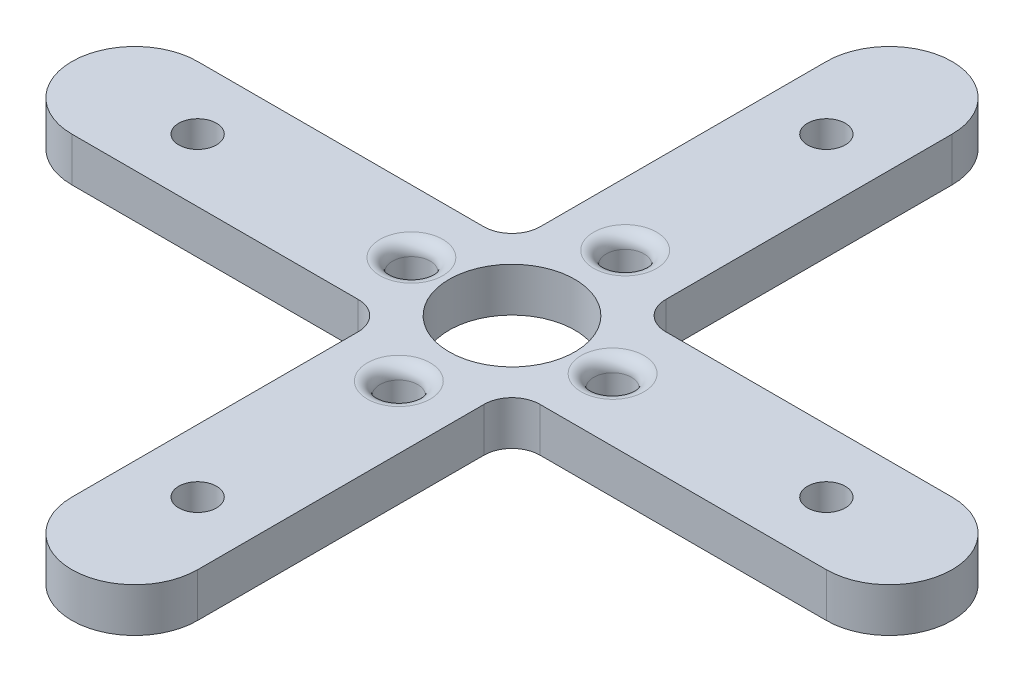
ISO-10303-21;
HEADER;
FILE_DESCRIPTION(('STEP AP214'),'2;1');
FILE_NAME('part.step','',(''),(''),'','','');
FILE_SCHEMA(('AUTOMOTIVE_DESIGN { 1 0 10303 214 1 1 1 1 }'));
ENDSEC;
DATA;
#1=APPLICATION_CONTEXT('core data for automotive mechanical design processes');
#2=APPLICATION_PROTOCOL_DEFINITION('international standard','automotive_design',2000,#1);
#3=PRODUCT_CONTEXT('',#1,'mechanical');
#4=PRODUCT('Part','Part','',(#3));
#5=PRODUCT_RELATED_PRODUCT_CATEGORY('part','',(#4));
#6=PRODUCT_DEFINITION_FORMATION('','',#4);
#7=PRODUCT_DEFINITION_CONTEXT('part definition',#1,'design');
#8=PRODUCT_DEFINITION('design','',#6,#7);
#9=PRODUCT_DEFINITION_SHAPE('','',#8);
#10=(LENGTH_UNIT() NAMED_UNIT(*) SI_UNIT(.MILLI.,.METRE.));
#11=(NAMED_UNIT(*) PLANE_ANGLE_UNIT() SI_UNIT($,.RADIAN.));
#12=(NAMED_UNIT(*) SI_UNIT($,.STERADIAN.) SOLID_ANGLE_UNIT());
#13=UNCERTAINTY_MEASURE_WITH_UNIT(LENGTH_MEASURE(1.E-05),#10,'distance_accuracy_value','');
#14=(GEOMETRIC_REPRESENTATION_CONTEXT(3) GLOBAL_UNCERTAINTY_ASSIGNED_CONTEXT((#13)) GLOBAL_UNIT_ASSIGNED_CONTEXT((#10,
#11,#12)) REPRESENTATION_CONTEXT('',''));
#15=CARTESIAN_POINT('',(0.,0.,0.));
#16=DIRECTION('',(0.,0.,1.));
#17=DIRECTION('',(1.,0.,0.));
#18=AXIS2_PLACEMENT_3D('',#15,#16,#17);
#19=CARTESIAN_POINT('',(-1.52427468028531,2.5,3.54645563387217));
#20=DIRECTION('',(0.,1.,0.));
#21=DIRECTION('',(0.,0.,1.));
#22=AXIS2_PLACEMENT_3D('',#19,#20,#21);
#23=TOROIDAL_SURFACE('',#22,2.5,1.);
#24=CARTESIAN_POINT('',(-1.52427468028531,2.5,3.54645563387217));
#25=DIRECTION('',(0.,1.,0.));
#26=DIRECTION('',(0.,0.,1.));
#27=AXIS2_PLACEMENT_3D('',#24,#25,#26);
#28=CIRCLE('',#27,1.5);
#29=CARTESIAN_POINT('',(-1.52427468028531,2.5,5.04645563387217));
#30=VERTEX_POINT('',#29);
#31=EDGE_CURVE('E50',#30,#30,#28,.T.);
#32=ORIENTED_EDGE('',*,*,#31,.F.);
#33=EDGE_LOOP('',(#32));
#34=FACE_BOUND('',#33,.T.);
#35=CARTESIAN_POINT('',(-1.52427468028531,3.5,3.54645563387217));
#36=DIRECTION('',(0.,1.,0.));
#37=DIRECTION('',(0.,0.,1.));
#38=AXIS2_PLACEMENT_3D('',#35,#36,#37);
#39=CIRCLE('',#38,2.5);
#40=CARTESIAN_POINT('',(-1.52427468028531,3.5,6.04645563387217));
#41=VERTEX_POINT('',#40);
#42=EDGE_CURVE('E11',#41,#41,#39,.F.);
#43=ORIENTED_EDGE('',*,*,#42,.F.);
#44=EDGE_LOOP('',(#43));
#45=FACE_BOUND('',#44,.T.);
#46=ADVANCED_FACE('F41',(#34,#45),#23,.T.);
#47=CARTESIAN_POINT('',(6.47572531971469,2.5,12.5464556338721));
#48=DIRECTION('',(0.,1.,0.));
#49=DIRECTION('',(0.,0.,1.));
#50=AXIS2_PLACEMENT_3D('',#47,#48,#49);
#51=TOROIDAL_SURFACE('',#50,2.5,1.);
#52=CARTESIAN_POINT('',(6.47572531971469,2.5,12.5464556338721));
#53=DIRECTION('',(0.,1.,0.));
#54=DIRECTION('',(0.,0.,1.));
#55=AXIS2_PLACEMENT_3D('',#52,#53,#54);
#56=CIRCLE('',#55,1.5);
#57=CARTESIAN_POINT('',(6.47572531971469,2.5,14.0464556338721));
#58=VERTEX_POINT('',#57);
#59=EDGE_CURVE('E344',#58,#58,#56,.T.);
#60=ORIENTED_EDGE('',*,*,#59,.F.);
#61=EDGE_LOOP('',(#60));
#62=FACE_BOUND('',#61,.T.);
#63=CARTESIAN_POINT('',(6.47572531971469,3.5,12.5464556338721));
#64=DIRECTION('',(0.,1.,0.));
#65=DIRECTION('',(0.,0.,1.));
#66=AXIS2_PLACEMENT_3D('',#63,#64,#65);
#67=CIRCLE('',#66,2.5);
#68=CARTESIAN_POINT('',(6.47572531971469,3.5,15.0464556338721));
#69=VERTEX_POINT('',#68);
#70=EDGE_CURVE('E348',#69,#69,#67,.F.);
#71=ORIENTED_EDGE('',*,*,#70,.F.);
#72=EDGE_LOOP('',(#71));
#73=FACE_BOUND('',#72,.T.);
#74=ADVANCED_FACE('F360',(#62,#73),#51,.T.);
#75=CARTESIAN_POINT('',(14.4757253197147,2.5,3.54645563387217));
#76=DIRECTION('',(0.,1.,0.));
#77=DIRECTION('',(0.,0.,1.));
#78=AXIS2_PLACEMENT_3D('',#75,#76,#77);
#79=TOROIDAL_SURFACE('',#78,2.5,1.);
#80=CARTESIAN_POINT('',(14.4757253197147,2.5,3.54645563387217));
#81=DIRECTION('',(0.,1.,0.));
#82=DIRECTION('',(0.,0.,1.));
#83=AXIS2_PLACEMENT_3D('',#80,#81,#82);
#84=CIRCLE('',#83,1.5);
#85=CARTESIAN_POINT('',(14.4757253197147,2.5,5.04645563387217));
#86=VERTEX_POINT('',#85);
#87=EDGE_CURVE('E336',#86,#86,#84,.T.);
#88=ORIENTED_EDGE('',*,*,#87,.F.);
#89=EDGE_LOOP('',(#88));
#90=FACE_BOUND('',#89,.T.);
#91=CARTESIAN_POINT('',(14.4757253197147,3.5,3.54645563387217));
#92=DIRECTION('',(0.,1.,0.));
#93=DIRECTION('',(0.,0.,1.));
#94=AXIS2_PLACEMENT_3D('',#91,#92,#93);
#95=CIRCLE('',#94,2.5);
#96=CARTESIAN_POINT('',(14.4757253197147,3.5,6.04645563387217));
#97=VERTEX_POINT('',#96);
#98=EDGE_CURVE('E340',#97,#97,#95,.F.);
#99=ORIENTED_EDGE('',*,*,#98,.F.);
#100=EDGE_LOOP('',(#99));
#101=FACE_BOUND('',#100,.T.);
#102=ADVANCED_FACE('F544',(#90,#101),#79,.T.);
#103=CARTESIAN_POINT('',(6.47572531971469,2.5,-5.45354436612787));
#104=DIRECTION('',(0.,1.,0.));
#105=DIRECTION('',(0.,0.,1.));
#106=AXIS2_PLACEMENT_3D('',#103,#104,#105);
#107=TOROIDAL_SURFACE('',#106,2.5,1.);
#108=CARTESIAN_POINT('',(6.47572531971469,2.5,-5.45354436612787));
#109=DIRECTION('',(0.,1.,0.));
#110=DIRECTION('',(0.,0.,1.));
#111=AXIS2_PLACEMENT_3D('',#108,#109,#110);
#112=CIRCLE('',#111,1.5);
#113=CARTESIAN_POINT('',(6.47572531971469,2.5,-3.95354436612787));
#114=VERTEX_POINT('',#113);
#115=EDGE_CURVE('E328',#114,#114,#112,.T.);
#116=ORIENTED_EDGE('',*,*,#115,.F.);
#117=EDGE_LOOP('',(#116));
#118=FACE_BOUND('',#117,.T.);
#119=CARTESIAN_POINT('',(6.47572531971469,3.5,-5.45354436612787));
#120=DIRECTION('',(0.,1.,0.));
#121=DIRECTION('',(0.,0.,1.));
#122=AXIS2_PLACEMENT_3D('',#119,#120,#121);
#123=CIRCLE('',#122,2.5);
#124=CARTESIAN_POINT('',(6.47572531971469,3.5,-2.95354436612787));
#125=VERTEX_POINT('',#124);
#126=EDGE_CURVE('E332',#125,#125,#123,.F.);
#127=ORIENTED_EDGE('',*,*,#126,.F.);
#128=EDGE_LOOP('',(#127));
#129=FACE_BOUND('',#128,.T.);
#130=ADVANCED_FACE('F514',(#118,#129),#107,.T.);
#131=CARTESIAN_POINT('',(1.47572531971469,3.5,0.));
#132=DIRECTION('',(1.,0.,0.));
#133=DIRECTION('',(0.,0.,-1.));
#134=AXIS2_PLACEMENT_3D('',#131,#132,#133);
#135=PLANE('',#134);
#136=DIRECTION('',(0.,0.,1.));
#137=VECTOR('',#136,1.);
#138=CARTESIAN_POINT('',(1.47572531971469,0.,0.));
#139=LINE('',#138,#137);
#140=CARTESIAN_POINT('',(1.47572531971468,0.,10.7886740611654));
#141=VERTEX_POINT('',#140);
#142=CARTESIAN_POINT('',(1.47572531971468,0.,33.5464556338722));
#143=VERTEX_POINT('',#142);
#144=EDGE_CURVE('E227',#141,#143,#139,.T.);
#145=ORIENTED_EDGE('',*,*,#144,.T.);
#146=DIRECTION('',(0.,-1.,0.));
#147=VECTOR('',#146,1.);
#148=CARTESIAN_POINT('',(1.47572531971468,3.5,33.5464556338722));
#149=LINE('',#148,#147);
#150=CARTESIAN_POINT('',(1.47572531971468,3.5,33.5464556338722));
#151=VERTEX_POINT('',#150);
#152=EDGE_CURVE('E325',#151,#143,#149,.T.);
#153=ORIENTED_EDGE('',*,*,#152,.F.);
#154=DIRECTION('',(0.,0.,1.));
#155=VECTOR('',#154,1.);
#156=CARTESIAN_POINT('',(1.47572531971469,3.5,0.));
#157=LINE('',#156,#155);
#158=CARTESIAN_POINT('',(1.47572531971468,3.5,10.7886740611654));
#159=VERTEX_POINT('',#158);
#160=EDGE_CURVE('E394',#159,#151,#157,.T.);
#161=ORIENTED_EDGE('',*,*,#160,.F.);
#162=DIRECTION('',(0.,-1.,0.));
#163=VECTOR('',#162,1.);
#164=CARTESIAN_POINT('',(1.47572531971468,3.5,10.7886740611654));
#165=LINE('',#164,#163);
#166=EDGE_CURVE('E187',#159,#141,#165,.T.);
#167=ORIENTED_EDGE('',*,*,#166,.T.);
#168=EDGE_LOOP('',(#145,#153,#161,#167));
#169=FACE_BOUND('',#168,.T.);
#170=ADVANCED_FACE('F449',(#169),#135,.F.);
#171=CARTESIAN_POINT('',(6.47572531971468,3.5,33.5464556338722));
#172=DIRECTION('',(0.,-1.,0.));
#173=DIRECTION('',(0.,0.,-1.));
#174=AXIS2_PLACEMENT_3D('',#171,#172,#173);
#175=CYLINDRICAL_SURFACE('',#174,5.);
#176=CARTESIAN_POINT('',(6.47572531971468,0.,33.5464556338722));
#177=DIRECTION('',(0.,1.,0.));
#178=DIRECTION('',(0.,0.,1.));
#179=AXIS2_PLACEMENT_3D('',#176,#177,#178);
#180=CIRCLE('',#179,5.);
#181=CARTESIAN_POINT('',(11.4757253197147,0.,33.5464556338722));
#182=VERTEX_POINT('',#181);
#183=EDGE_CURVE('E231',#143,#182,#180,.T.);
#184=ORIENTED_EDGE('',*,*,#183,.T.);
#185=DIRECTION('',(0.,-1.,0.));
#186=VECTOR('',#185,1.);
#187=CARTESIAN_POINT('',(11.4757253197147,3.5,33.5464556338722));
#188=LINE('',#187,#186);
#189=CARTESIAN_POINT('',(11.4757253197147,3.5,33.5464556338722));
#190=VERTEX_POINT('',#189);
#191=EDGE_CURVE('E321',#190,#182,#188,.T.);
#192=ORIENTED_EDGE('',*,*,#191,.F.);
#193=CARTESIAN_POINT('',(6.47572531971468,3.5,33.5464556338722));
#194=DIRECTION('',(0.,1.,0.));
#195=DIRECTION('',(0.,0.,1.));
#196=AXIS2_PLACEMENT_3D('',#193,#194,#195);
#197=CIRCLE('',#196,5.);
#198=EDGE_CURVE('E126',#151,#190,#197,.T.);
#199=ORIENTED_EDGE('',*,*,#198,.F.);
#200=ORIENTED_EDGE('',*,*,#152,.T.);
#201=EDGE_LOOP('',(#184,#192,#199,#200));
#202=FACE_BOUND('',#201,.T.);
#203=ADVANCED_FACE('F508',(#202),#175,.T.);
#204=CARTESIAN_POINT('',(11.4757253197147,3.5,0.));
#205=DIRECTION('',(-1.,0.,0.));
#206=DIRECTION('',(0.,0.,1.));
#207=AXIS2_PLACEMENT_3D('',#204,#205,#206);
#208=PLANE('',#207);
#209=DIRECTION('',(0.,0.,-1.));
#210=VECTOR('',#209,1.);
#211=CARTESIAN_POINT('',(11.4757253197147,0.,0.));
#212=LINE('',#211,#210);
#213=CARTESIAN_POINT('',(11.4757253197147,0.,10.7886740611654));
#214=VERTEX_POINT('',#213);
#215=EDGE_CURVE('E234',#182,#214,#212,.T.);
#216=ORIENTED_EDGE('',*,*,#215,.T.);
#217=DIRECTION('',(0.,-1.,0.));
#218=VECTOR('',#217,1.);
#219=CARTESIAN_POINT('',(11.4757253197147,3.5,10.7886740611654));
#220=LINE('',#219,#218);
#221=CARTESIAN_POINT('',(11.4757253197147,3.5,10.7886740611654));
#222=VERTEX_POINT('',#221);
#223=EDGE_CURVE('E318',#222,#214,#220,.T.);
#224=ORIENTED_EDGE('',*,*,#223,.F.);
#225=DIRECTION('',(0.,0.,-1.));
#226=VECTOR('',#225,1.);
#227=CARTESIAN_POINT('',(11.4757253197147,3.5,0.));
#228=LINE('',#227,#226);
#229=EDGE_CURVE('E404',#190,#222,#228,.T.);
#230=ORIENTED_EDGE('',*,*,#229,.F.);
#231=ORIENTED_EDGE('',*,*,#191,.T.);
#232=EDGE_LOOP('',(#216,#224,#230,#231));
#233=FACE_BOUND('',#232,.T.);
#234=ADVANCED_FACE('F504',(#233),#208,.F.);
#235=CARTESIAN_POINT('',(13.6976972523665,3.5,10.7685189761164));
#236=DIRECTION('',(0.,-1.,0.));
#237=DIRECTION('',(0.,0.,-1.));
#238=AXIS2_PLACEMENT_3D('',#235,#236,#237);
#239=CYLINDRICAL_SURFACE('',#238,2.22206334224426);
#240=CARTESIAN_POINT('',(13.6976972523665,0.,10.7685189761164));
#241=DIRECTION('',(0.,1.,0.));
#242=DIRECTION('',(0.,0.,1.));
#243=AXIS2_PLACEMENT_3D('',#240,#241,#242);
#244=CIRCLE('',#243,2.22206334224426);
#245=CARTESIAN_POINT('',(13.6976972523665,0.,8.54645563387217));
#246=VERTEX_POINT('',#245);
#247=EDGE_CURVE('E238',#246,#214,#244,.T.);
#248=ORIENTED_EDGE('',*,*,#247,.F.);
#249=DIRECTION('',(0.,-1.,0.));
#250=VECTOR('',#249,1.);
#251=CARTESIAN_POINT('',(13.6976972523665,3.5,8.54645563387217));
#252=LINE('',#251,#250);
#253=CARTESIAN_POINT('',(13.6976972523665,3.5,8.54645563387217));
#254=VERTEX_POINT('',#253);
#255=EDGE_CURVE('E315',#254,#246,#252,.T.);
#256=ORIENTED_EDGE('',*,*,#255,.F.);
#257=CARTESIAN_POINT('',(13.6976972523665,3.5,10.7685189761164));
#258=DIRECTION('',(0.,1.,0.));
#259=DIRECTION('',(0.,0.,1.));
#260=AXIS2_PLACEMENT_3D('',#257,#258,#259);
#261=CIRCLE('',#260,2.22206334224426);
#262=EDGE_CURVE('E407',#254,#222,#261,.T.);
#263=ORIENTED_EDGE('',*,*,#262,.T.);
#264=ORIENTED_EDGE('',*,*,#223,.T.);
#265=EDGE_LOOP('',(#248,#256,#263,#264));
#266=FACE_BOUND('',#265,.T.);
#267=ADVANCED_FACE('F500',(#266),#239,.F.);
#268=CARTESIAN_POINT('',(0.,3.5,8.54645563387217));
#269=DIRECTION('',(0.,0.,-1.));
#270=DIRECTION('',(-1.,0.,0.));
#271=AXIS2_PLACEMENT_3D('',#268,#269,#270);
#272=PLANE('',#271);
#273=DIRECTION('',(1.,0.,0.));
#274=VECTOR('',#273,1.);
#275=CARTESIAN_POINT('',(0.,0.,8.54645563387217));
#276=LINE('',#275,#274);
#277=CARTESIAN_POINT('',(36.4757253197147,0.,8.54645563387217));
#278=VERTEX_POINT('',#277);
#279=EDGE_CURVE('E242',#246,#278,#276,.T.);
#280=ORIENTED_EDGE('',*,*,#279,.T.);
#281=DIRECTION('',(0.,-1.,0.));
#282=VECTOR('',#281,1.);
#283=CARTESIAN_POINT('',(36.4757253197147,3.5,8.54645563387217));
#284=LINE('',#283,#282);
#285=CARTESIAN_POINT('',(36.4757253197147,3.5,8.54645563387217));
#286=VERTEX_POINT('',#285);
#287=EDGE_CURVE('E311',#286,#278,#284,.T.);
#288=ORIENTED_EDGE('',*,*,#287,.F.);
#289=DIRECTION('',(1.,0.,0.));
#290=VECTOR('',#289,1.);
#291=CARTESIAN_POINT('',(0.,3.5,8.54645563387217));
#292=LINE('',#291,#290);
#293=EDGE_CURVE('E411',#254,#286,#292,.T.);
#294=ORIENTED_EDGE('',*,*,#293,.F.);
#295=ORIENTED_EDGE('',*,*,#255,.T.);
#296=EDGE_LOOP('',(#280,#288,#294,#295));
#297=FACE_BOUND('',#296,.T.);
#298=ADVANCED_FACE('F496',(#297),#272,.F.);
#299=CARTESIAN_POINT('',(36.4757253197147,3.5,3.54645563387217));
#300=DIRECTION('',(0.,-1.,0.));
#301=DIRECTION('',(0.,0.,-1.));
#302=AXIS2_PLACEMENT_3D('',#299,#300,#301);
#303=CYLINDRICAL_SURFACE('',#302,5.);
#304=CARTESIAN_POINT('',(36.4757253197147,0.,3.54645563387217));
#305=DIRECTION('',(0.,1.,0.));
#306=DIRECTION('',(0.,0.,1.));
#307=AXIS2_PLACEMENT_3D('',#304,#305,#306);
#308=CIRCLE('',#307,5.);
#309=CARTESIAN_POINT('',(36.4757253197147,0.,-1.45354436612783));
#310=VERTEX_POINT('',#309);
#311=EDGE_CURVE('E245',#278,#310,#308,.T.);
#312=ORIENTED_EDGE('',*,*,#311,.T.);
#313=DIRECTION('',(0.,-1.,0.));
#314=VECTOR('',#313,1.);
#315=CARTESIAN_POINT('',(36.4757253197147,3.5,-1.45354436612783));
#316=LINE('',#315,#314);
#317=CARTESIAN_POINT('',(36.4757253197147,3.5,-1.45354436612783));
#318=VERTEX_POINT('',#317);
#319=EDGE_CURVE('E308',#318,#310,#316,.T.);
#320=ORIENTED_EDGE('',*,*,#319,.F.);
#321=CARTESIAN_POINT('',(36.4757253197147,3.5,3.54645563387217));
#322=DIRECTION('',(0.,1.,0.));
#323=DIRECTION('',(0.,0.,1.));
#324=AXIS2_PLACEMENT_3D('',#321,#322,#323);
#325=CIRCLE('',#324,5.);
#326=EDGE_CURVE('E414',#286,#318,#325,.T.);
#327=ORIENTED_EDGE('',*,*,#326,.F.);
#328=ORIENTED_EDGE('',*,*,#287,.T.);
#329=EDGE_LOOP('',(#312,#320,#327,#328));
#330=FACE_BOUND('',#329,.T.);
#331=ADVANCED_FACE('F492',(#330),#303,.T.);
#332=CARTESIAN_POINT('',(0.,3.5,-1.45354436612783));
#333=DIRECTION('',(0.,0.,-1.));
#334=DIRECTION('',(-1.,0.,0.));
#335=AXIS2_PLACEMENT_3D('',#332,#333,#334);
#336=PLANE('',#335);
#337=DIRECTION('',(1.,0.,0.));
#338=VECTOR('',#337,1.);
#339=CARTESIAN_POINT('',(0.,0.,-1.45354436612783));
#340=LINE('',#339,#338);
#341=CARTESIAN_POINT('',(13.6976972523665,0.,-1.45354436612783));
#342=VERTEX_POINT('',#341);
#343=EDGE_CURVE('E249',#342,#310,#340,.T.);
#344=ORIENTED_EDGE('',*,*,#343,.F.);
#345=DIRECTION('',(0.,-1.,0.));
#346=VECTOR('',#345,1.);
#347=CARTESIAN_POINT('',(13.6976972523665,3.5,-1.45354436612783));
#348=LINE('',#347,#346);
#349=CARTESIAN_POINT('',(13.6976972523665,3.5,-1.45354436612783));
#350=VERTEX_POINT('',#349);
#351=EDGE_CURVE('E305',#350,#342,#348,.T.);
#352=ORIENTED_EDGE('',*,*,#351,.F.);
#353=DIRECTION('',(1.,0.,0.));
#354=VECTOR('',#353,1.);
#355=CARTESIAN_POINT('',(0.,3.5,-1.45354436612783));
#356=LINE('',#355,#354);
#357=EDGE_CURVE('E417',#350,#318,#356,.T.);
#358=ORIENTED_EDGE('',*,*,#357,.T.);
#359=ORIENTED_EDGE('',*,*,#319,.T.);
#360=EDGE_LOOP('',(#344,#352,#358,#359));
#361=FACE_BOUND('',#360,.T.);
#362=ADVANCED_FACE('F488',(#361),#336,.T.);
#363=CARTESIAN_POINT('',(13.6976972523665,3.5,-3.67560770837209));
#364=DIRECTION('',(0.,-1.,0.));
#365=DIRECTION('',(0.,0.,-1.));
#366=AXIS2_PLACEMENT_3D('',#363,#364,#365);
#367=CYLINDRICAL_SURFACE('',#366,2.22206334224426);
#368=CARTESIAN_POINT('',(13.6976972523665,0.,-3.67560770837209));
#369=DIRECTION('',(0.,1.,0.));
#370=DIRECTION('',(0.,0.,1.));
#371=AXIS2_PLACEMENT_3D('',#368,#369,#370);
#372=CIRCLE('',#371,2.22206334224426);
#373=CARTESIAN_POINT('',(11.4757253197147,0.,-3.6957627934212));
#374=VERTEX_POINT('',#373);
#375=EDGE_CURVE('E253',#374,#342,#372,.T.);
#376=ORIENTED_EDGE('',*,*,#375,.F.);
#377=DIRECTION('',(0.,-1.,0.));
#378=VECTOR('',#377,1.);
#379=CARTESIAN_POINT('',(11.4757253197147,3.5,-3.6957627934212));
#380=LINE('',#379,#378);
#381=CARTESIAN_POINT('',(11.4757253197147,3.5,-3.6957627934212));
#382=VERTEX_POINT('',#381);
#383=EDGE_CURVE('E302',#382,#374,#380,.T.);
#384=ORIENTED_EDGE('',*,*,#383,.F.);
#385=CARTESIAN_POINT('',(13.6976972523665,3.5,-3.67560770837209));
#386=DIRECTION('',(0.,1.,0.));
#387=DIRECTION('',(0.,0.,1.));
#388=AXIS2_PLACEMENT_3D('',#385,#386,#387);
#389=CIRCLE('',#388,2.22206334224426);
#390=EDGE_CURVE('E421',#382,#350,#389,.T.);
#391=ORIENTED_EDGE('',*,*,#390,.T.);
#392=ORIENTED_EDGE('',*,*,#351,.T.);
#393=EDGE_LOOP('',(#376,#384,#391,#392));
#394=FACE_BOUND('',#393,.T.);
#395=ADVANCED_FACE('F484',(#394),#367,.F.);
#396=CARTESIAN_POINT('',(11.4757253197147,3.5,0.));
#397=DIRECTION('',(1.,0.,0.));
#398=DIRECTION('',(0.,0.,-1.));
#399=AXIS2_PLACEMENT_3D('',#396,#397,#398);
#400=PLANE('',#399);
#401=DIRECTION('',(0.,0.,1.));
#402=VECTOR('',#401,1.);
#403=CARTESIAN_POINT('',(11.4757253197147,0.,0.));
#404=LINE('',#403,#402);
#405=CARTESIAN_POINT('',(11.4757253197147,0.,-26.4535443661278));
#406=VERTEX_POINT('',#405);
#407=EDGE_CURVE('E257',#406,#374,#404,.T.);
#408=ORIENTED_EDGE('',*,*,#407,.F.);
#409=DIRECTION('',(0.,-1.,0.));
#410=VECTOR('',#409,1.);
#411=CARTESIAN_POINT('',(11.4757253197147,3.5,-26.4535443661278));
#412=LINE('',#411,#410);
#413=CARTESIAN_POINT('',(11.4757253197147,3.5,-26.4535443661278));
#414=VERTEX_POINT('',#413);
#415=EDGE_CURVE('E299',#414,#406,#412,.T.);
#416=ORIENTED_EDGE('',*,*,#415,.F.);
#417=DIRECTION('',(0.,0.,1.));
#418=VECTOR('',#417,1.);
#419=CARTESIAN_POINT('',(11.4757253197147,3.5,0.));
#420=LINE('',#419,#418);
#421=EDGE_CURVE('E425',#414,#382,#420,.T.);
#422=ORIENTED_EDGE('',*,*,#421,.T.);
#423=ORIENTED_EDGE('',*,*,#383,.T.);
#424=EDGE_LOOP('',(#408,#416,#422,#423));
#425=FACE_BOUND('',#424,.T.);
#426=ADVANCED_FACE('F480',(#425),#400,.T.);
#427=CARTESIAN_POINT('',(6.47572531971468,3.5,-26.4535443661278));
#428=DIRECTION('',(0.,-1.,0.));
#429=DIRECTION('',(0.,0.,-1.));
#430=AXIS2_PLACEMENT_3D('',#427,#428,#429);
#431=CYLINDRICAL_SURFACE('',#430,5.);
#432=CARTESIAN_POINT('',(6.47572531971468,0.,-26.4535443661278));
#433=DIRECTION('',(0.,1.,0.));
#434=DIRECTION('',(0.,0.,1.));
#435=AXIS2_PLACEMENT_3D('',#432,#433,#434);
#436=CIRCLE('',#435,5.);
#437=CARTESIAN_POINT('',(1.47572531971468,0.,-26.4535443661278));
#438=VERTEX_POINT('',#437);
#439=EDGE_CURVE('E261',#406,#438,#436,.T.);
#440=ORIENTED_EDGE('',*,*,#439,.T.);
#441=DIRECTION('',(0.,-1.,0.));
#442=VECTOR('',#441,1.);
#443=CARTESIAN_POINT('',(1.47572531971468,3.5,-26.4535443661278));
#444=LINE('',#443,#442);
#445=CARTESIAN_POINT('',(1.47572531971468,3.5,-26.4535443661278));
#446=VERTEX_POINT('',#445);
#447=EDGE_CURVE('E296',#446,#438,#444,.T.);
#448=ORIENTED_EDGE('',*,*,#447,.F.);
#449=CARTESIAN_POINT('',(6.47572531971468,3.5,-26.4535443661278));
#450=DIRECTION('',(0.,1.,0.));
#451=DIRECTION('',(0.,0.,1.));
#452=AXIS2_PLACEMENT_3D('',#449,#450,#451);
#453=CIRCLE('',#452,5.);
#454=EDGE_CURVE('E429',#414,#446,#453,.T.);
#455=ORIENTED_EDGE('',*,*,#454,.F.);
#456=ORIENTED_EDGE('',*,*,#415,.T.);
#457=EDGE_LOOP('',(#440,#448,#455,#456));
#458=FACE_BOUND('',#457,.T.);
#459=ADVANCED_FACE('F476',(#458),#431,.T.);
#460=CARTESIAN_POINT('',(1.47572531971468,3.5,0.));
#461=DIRECTION('',(-1.,0.,0.));
#462=DIRECTION('',(0.,0.,1.));
#463=AXIS2_PLACEMENT_3D('',#460,#461,#462);
#464=PLANE('',#463);
#465=DIRECTION('',(0.,0.,-1.));
#466=VECTOR('',#465,1.);
#467=CARTESIAN_POINT('',(1.47572531971468,0.,0.));
#468=LINE('',#467,#466);
#469=CARTESIAN_POINT('',(1.47572531971468,0.,-3.69576279342108));
#470=VERTEX_POINT('',#469);
#471=EDGE_CURVE('E265',#470,#438,#468,.T.);
#472=ORIENTED_EDGE('',*,*,#471,.F.);
#473=DIRECTION('',(0.,-1.,0.));
#474=VECTOR('',#473,1.);
#475=CARTESIAN_POINT('',(1.47572531971468,3.5,-3.69576279342108));
#476=LINE('',#475,#474);
#477=CARTESIAN_POINT('',(1.47572531971468,3.5,-3.69576279342108));
#478=VERTEX_POINT('',#477);
#479=EDGE_CURVE('E293',#478,#470,#476,.T.);
#480=ORIENTED_EDGE('',*,*,#479,.F.);
#481=DIRECTION('',(0.,0.,-1.));
#482=VECTOR('',#481,1.);
#483=CARTESIAN_POINT('',(1.47572531971468,3.5,0.));
#484=LINE('',#483,#482);
#485=EDGE_CURVE('E432',#478,#446,#484,.T.);
#486=ORIENTED_EDGE('',*,*,#485,.T.);
#487=ORIENTED_EDGE('',*,*,#447,.T.);
#488=EDGE_LOOP('',(#472,#480,#486,#487));
#489=FACE_BOUND('',#488,.T.);
#490=ADVANCED_FACE('F472',(#489),#464,.T.);
#491=CARTESIAN_POINT('',(-0.766493107578561,3.5,-3.69576279342108));
#492=DIRECTION('',(0.,-1.,0.));
#493=DIRECTION('',(0.,0.,-1.));
#494=AXIS2_PLACEMENT_3D('',#491,#492,#493);
#495=CYLINDRICAL_SURFACE('',#494,2.24221842729325);
#496=CARTESIAN_POINT('',(-0.766493107578561,0.,-3.69576279342108));
#497=DIRECTION('',(0.,1.,0.));
#498=DIRECTION('',(0.,0.,1.));
#499=AXIS2_PLACEMENT_3D('',#496,#497,#498);
#500=CIRCLE('',#499,2.24221842729325);
#501=CARTESIAN_POINT('',(-0.766493107578561,0.,-1.45354436612783));
#502=VERTEX_POINT('',#501);
#503=EDGE_CURVE('E269',#502,#470,#500,.T.);
#504=ORIENTED_EDGE('',*,*,#503,.F.);
#505=DIRECTION('',(0.,-1.,0.));
#506=VECTOR('',#505,1.);
#507=CARTESIAN_POINT('',(-0.766493107578561,3.5,-1.45354436612783));
#508=LINE('',#507,#506);
#509=CARTESIAN_POINT('',(-0.766493107578561,3.5,-1.45354436612783));
#510=VERTEX_POINT('',#509);
#511=EDGE_CURVE('E290',#510,#502,#508,.T.);
#512=ORIENTED_EDGE('',*,*,#511,.F.);
#513=CARTESIAN_POINT('',(-0.766493107578561,3.5,-3.69576279342108));
#514=DIRECTION('',(0.,1.,0.));
#515=DIRECTION('',(0.,0.,1.));
#516=AXIS2_PLACEMENT_3D('',#513,#514,#515);
#517=CIRCLE('',#516,2.24221842729325);
#518=EDGE_CURVE('E436',#510,#478,#517,.T.);
#519=ORIENTED_EDGE('',*,*,#518,.T.);
#520=ORIENTED_EDGE('',*,*,#479,.T.);
#521=EDGE_LOOP('',(#504,#512,#519,#520));
#522=FACE_BOUND('',#521,.T.);
#523=ADVANCED_FACE('F469',(#522),#495,.F.);
#524=CARTESIAN_POINT('',(0.,3.5,-1.45354436612783));
#525=DIRECTION('',(0.,0.,-1.));
#526=DIRECTION('',(-1.,0.,0.));
#527=AXIS2_PLACEMENT_3D('',#524,#525,#526);
#528=PLANE('',#527);
#529=DIRECTION('',(1.,0.,0.));
#530=VECTOR('',#529,1.);
#531=CARTESIAN_POINT('',(0.,0.,-1.45354436612783));
#532=LINE('',#531,#530);
#533=CARTESIAN_POINT('',(-23.5242746802853,0.,-1.45354436612783));
#534=VERTEX_POINT('',#533);
#535=EDGE_CURVE('E273',#534,#502,#532,.T.);
#536=ORIENTED_EDGE('',*,*,#535,.F.);
#537=DIRECTION('',(0.,-1.,0.));
#538=VECTOR('',#537,1.);
#539=CARTESIAN_POINT('',(-23.5242746802853,3.5,-1.45354436612783));
#540=LINE('',#539,#538);
#541=CARTESIAN_POINT('',(-23.5242746802853,3.5,-1.45354436612783));
#542=VERTEX_POINT('',#541);
#543=EDGE_CURVE('E180',#542,#534,#540,.T.);
#544=ORIENTED_EDGE('',*,*,#543,.F.);
#545=DIRECTION('',(1.,0.,0.));
#546=VECTOR('',#545,1.);
#547=CARTESIAN_POINT('',(0.,3.5,-1.45354436612783));
#548=LINE('',#547,#546);
#549=EDGE_CURVE('E171',#542,#510,#548,.T.);
#550=ORIENTED_EDGE('',*,*,#549,.T.);
#551=ORIENTED_EDGE('',*,*,#511,.T.);
#552=EDGE_LOOP('',(#536,#544,#550,#551));
#553=FACE_BOUND('',#552,.T.);
#554=ADVANCED_FACE('F442',(#553),#528,.T.);
#555=CARTESIAN_POINT('',(-23.5242746802853,3.5,3.54645563387217));
#556=DIRECTION('',(0.,-1.,0.));
#557=DIRECTION('',(0.,0.,-1.));
#558=AXIS2_PLACEMENT_3D('',#555,#556,#557);
#559=CYLINDRICAL_SURFACE('',#558,5.);
#560=CARTESIAN_POINT('',(-23.5242746802853,0.,3.54645563387217));
#561=DIRECTION('',(0.,1.,0.));
#562=DIRECTION('',(0.,0.,1.));
#563=AXIS2_PLACEMENT_3D('',#560,#561,#562);
#564=CIRCLE('',#563,5.);
#565=CARTESIAN_POINT('',(-23.5242746802853,0.,8.54645563387217));
#566=VERTEX_POINT('',#565);
#567=EDGE_CURVE('E178',#534,#566,#564,.T.);
#568=ORIENTED_EDGE('',*,*,#567,.T.);
#569=DIRECTION('',(0.,-1.,0.));
#570=VECTOR('',#569,1.);
#571=CARTESIAN_POINT('',(-23.5242746802853,3.5,8.54645563387217));
#572=LINE('',#571,#570);
#573=CARTESIAN_POINT('',(-23.5242746802853,3.5,8.54645563387217));
#574=VERTEX_POINT('',#573);
#575=EDGE_CURVE('E175',#574,#566,#572,.T.);
#576=ORIENTED_EDGE('',*,*,#575,.F.);
#577=CARTESIAN_POINT('',(-23.5242746802853,3.5,3.54645563387217));
#578=DIRECTION('',(0.,1.,0.));
#579=DIRECTION('',(0.,0.,1.));
#580=AXIS2_PLACEMENT_3D('',#577,#578,#579);
#581=CIRCLE('',#580,5.);
#582=EDGE_CURVE('E164',#542,#574,#581,.T.);
#583=ORIENTED_EDGE('',*,*,#582,.F.);
#584=ORIENTED_EDGE('',*,*,#543,.T.);
#585=EDGE_LOOP('',(#568,#576,#583,#584));
#586=FACE_BOUND('',#585,.T.);
#587=ADVANCED_FACE('F176',(#586),#559,.T.);
#588=CARTESIAN_POINT('',(0.,3.5,8.54645563387217));
#589=DIRECTION('',(0.,0.,-1.));
#590=DIRECTION('',(-1.,0.,0.));
#591=AXIS2_PLACEMENT_3D('',#588,#589,#590);
#592=PLANE('',#591);
#593=DIRECTION('',(1.,0.,0.));
#594=VECTOR('',#593,1.);
#595=CARTESIAN_POINT('',(0.,0.,8.54645563387217));
#596=LINE('',#595,#594);
#597=CARTESIAN_POINT('',(-0.766493107578561,0.,8.54645563387217));
#598=VERTEX_POINT('',#597);
#599=EDGE_CURVE('E111',#566,#598,#596,.T.);
#600=ORIENTED_EDGE('',*,*,#599,.T.);
#601=DIRECTION('',(0.,-1.,0.));
#602=VECTOR('',#601,1.);
#603=CARTESIAN_POINT('',(-0.766493107578561,3.5,8.54645563387217));
#604=LINE('',#603,#602);
#605=CARTESIAN_POINT('',(-0.766493107578561,3.5,8.54645563387217));
#606=VERTEX_POINT('',#605);
#607=EDGE_CURVE('E181',#606,#598,#604,.T.);
#608=ORIENTED_EDGE('',*,*,#607,.F.);
#609=DIRECTION('',(1.,0.,0.));
#610=VECTOR('',#609,1.);
#611=CARTESIAN_POINT('',(0.,3.5,8.54645563387217));
#612=LINE('',#611,#610);
#613=EDGE_CURVE('E168',#574,#606,#612,.T.);
#614=ORIENTED_EDGE('',*,*,#613,.F.);
#615=ORIENTED_EDGE('',*,*,#575,.T.);
#616=EDGE_LOOP('',(#600,#608,#614,#615));
#617=FACE_BOUND('',#616,.T.);
#618=ADVANCED_FACE('F183',(#617),#592,.F.);
#619=CARTESIAN_POINT('',(6.47572531971469,3.5,3.54645563387217));
#620=DIRECTION('',(0.,-1.,0.));
#621=DIRECTION('',(0.,0.,-1.));
#622=AXIS2_PLACEMENT_3D('',#619,#620,#621);
#623=CYLINDRICAL_SURFACE('',#622,5.);
#624=CARTESIAN_POINT('',(6.47572531971469,3.5,3.54645563387217));
#625=DIRECTION('',(0.,1.,0.));
#626=DIRECTION('',(0.,0.,1.));
#627=AXIS2_PLACEMENT_3D('',#624,#625,#626);
#628=CIRCLE('',#627,5.);
#629=CARTESIAN_POINT('',(6.47572531971469,3.5,8.54645563387217));
#630=VERTEX_POINT('',#629);
#631=EDGE_CURVE('E391',#630,#630,#628,.T.);
#632=ORIENTED_EDGE('',*,*,#631,.T.);
#633=EDGE_LOOP('',(#632));
#634=FACE_BOUND('',#633,.T.);
#635=CARTESIAN_POINT('',(6.47572531971469,0.,3.54645563387217));
#636=DIRECTION('',(0.,1.,0.));
#637=DIRECTION('',(0.,0.,1.));
#638=AXIS2_PLACEMENT_3D('',#635,#636,#637);
#639=CIRCLE('',#638,5.);
#640=CARTESIAN_POINT('',(6.47572531971469,0.,8.54645563387217));
#641=VERTEX_POINT('',#640);
#642=EDGE_CURVE('E223',#641,#641,#639,.T.);
#643=ORIENTED_EDGE('',*,*,#642,.F.);
#644=EDGE_LOOP('',(#643));
#645=FACE_BOUND('',#644,.T.);
#646=ADVANCED_FACE('F464',(#634,#645),#623,.F.);
#647=CARTESIAN_POINT('',(-1.52427468028531,3.5,3.54645563387217));
#648=DIRECTION('',(0.,-1.,0.));
#649=DIRECTION('',(0.,0.,-1.));
#650=AXIS2_PLACEMENT_3D('',#647,#648,#649);
#651=CYLINDRICAL_SURFACE('',#650,1.5);
#652=ORIENTED_EDGE('',*,*,#31,.T.);
#653=EDGE_LOOP('',(#652));
#654=FACE_BOUND('',#653,.T.);
#655=CARTESIAN_POINT('',(-1.52427468028531,0.,3.54645563387217));
#656=DIRECTION('',(0.,1.,0.));
#657=DIRECTION('',(0.,0.,1.));
#658=AXIS2_PLACEMENT_3D('',#655,#656,#657);
#659=CIRCLE('',#658,1.5);
#660=CARTESIAN_POINT('',(-1.52427468028531,0.,5.04645563387217));
#661=VERTEX_POINT('',#660);
#662=EDGE_CURVE('E219',#661,#661,#659,.T.);
#663=ORIENTED_EDGE('',*,*,#662,.F.);
#664=EDGE_LOOP('',(#663));
#665=FACE_BOUND('',#664,.T.);
#666=ADVANCED_FACE('F355',(#654,#665),#651,.F.);
#667=CARTESIAN_POINT('',(14.4757253197147,3.5,3.54645563387217));
#668=DIRECTION('',(0.,-1.,0.));
#669=DIRECTION('',(0.,0.,-1.));
#670=AXIS2_PLACEMENT_3D('',#667,#668,#669);
#671=CYLINDRICAL_SURFACE('',#670,1.5);
#672=ORIENTED_EDGE('',*,*,#87,.T.);
#673=EDGE_LOOP('',(#672));
#674=FACE_BOUND('',#673,.T.);
#675=CARTESIAN_POINT('',(14.4757253197147,0.,3.54645563387217));
#676=DIRECTION('',(0.,1.,0.));
#677=DIRECTION('',(0.,0.,1.));
#678=AXIS2_PLACEMENT_3D('',#675,#676,#677);
#679=CIRCLE('',#678,1.5);
#680=CARTESIAN_POINT('',(14.4757253197147,0.,5.04645563387217));
#681=VERTEX_POINT('',#680);
#682=EDGE_CURVE('E215',#681,#681,#679,.T.);
#683=ORIENTED_EDGE('',*,*,#682,.F.);
#684=EDGE_LOOP('',(#683));
#685=FACE_BOUND('',#684,.T.);
#686=ADVANCED_FACE('F519',(#674,#685),#671,.F.);
#687=CARTESIAN_POINT('',(-18.5242746802853,3.5,3.54645563387217));
#688=DIRECTION('',(0.,-1.,0.));
#689=DIRECTION('',(0.,0.,-1.));
#690=AXIS2_PLACEMENT_3D('',#687,#688,#689);
#691=CYLINDRICAL_SURFACE('',#690,1.5);
#692=CARTESIAN_POINT('',(-18.5242746802853,3.5,3.54645563387217));
#693=DIRECTION('',(0.,1.,0.));
#694=DIRECTION('',(0.,0.,1.));
#695=AXIS2_PLACEMENT_3D('',#692,#693,#694);
#696=CIRCLE('',#695,1.5);
#697=CARTESIAN_POINT('',(-18.5242746802853,3.5,5.04645563387217));
#698=VERTEX_POINT('',#697);
#699=EDGE_CURVE('E388',#698,#698,#696,.T.);
#700=ORIENTED_EDGE('',*,*,#699,.T.);
#701=EDGE_LOOP('',(#700));
#702=FACE_BOUND('',#701,.T.);
#703=CARTESIAN_POINT('',(-18.5242746802853,0.,3.54645563387217));
#704=DIRECTION('',(0.,1.,0.));
#705=DIRECTION('',(0.,0.,1.));
#706=AXIS2_PLACEMENT_3D('',#703,#704,#705);
#707=CIRCLE('',#706,1.5);
#708=CARTESIAN_POINT('',(-18.5242746802853,0.,5.04645563387217));
#709=VERTEX_POINT('',#708);
#710=EDGE_CURVE('E211',#709,#709,#707,.T.);
#711=ORIENTED_EDGE('',*,*,#710,.F.);
#712=EDGE_LOOP('',(#711));
#713=FACE_BOUND('',#712,.T.);
#714=ADVANCED_FACE('F522',(#702,#713),#691,.F.);
#715=CARTESIAN_POINT('',(6.47572531971469,3.5,-21.4535443661279));
#716=DIRECTION('',(0.,-1.,0.));
#717=DIRECTION('',(0.,0.,-1.));
#718=AXIS2_PLACEMENT_3D('',#715,#716,#717);
#719=CYLINDRICAL_SURFACE('',#718,1.5);
#720=CARTESIAN_POINT('',(6.47572531971469,3.5,-21.4535443661279));
#721=DIRECTION('',(0.,1.,0.));
#722=DIRECTION('',(0.,0.,1.));
#723=AXIS2_PLACEMENT_3D('',#720,#721,#722);
#724=CIRCLE('',#723,1.5);
#725=CARTESIAN_POINT('',(6.47572531971469,3.5,-19.9535443661279));
#726=VERTEX_POINT('',#725);
#727=EDGE_CURVE('E384',#726,#726,#724,.T.);
#728=ORIENTED_EDGE('',*,*,#727,.T.);
#729=EDGE_LOOP('',(#728));
#730=FACE_BOUND('',#729,.T.);
#731=CARTESIAN_POINT('',(6.47572531971469,0.,-21.4535443661279));
#732=DIRECTION('',(0.,1.,0.));
#733=DIRECTION('',(0.,0.,1.));
#734=AXIS2_PLACEMENT_3D('',#731,#732,#733);
#735=CIRCLE('',#734,1.5);
#736=CARTESIAN_POINT('',(6.47572531971469,0.,-19.9535443661279));
#737=VERTEX_POINT('',#736);
#738=EDGE_CURVE('E207',#737,#737,#735,.T.);
#739=ORIENTED_EDGE('',*,*,#738,.F.);
#740=EDGE_LOOP('',(#739));
#741=FACE_BOUND('',#740,.T.);
#742=ADVANCED_FACE('F526',(#730,#741),#719,.F.);
#743=CARTESIAN_POINT('',(31.4757253197147,3.5,3.54645563387213));
#744=DIRECTION('',(0.,-1.,0.));
#745=DIRECTION('',(0.,0.,-1.));
#746=AXIS2_PLACEMENT_3D('',#743,#744,#745);
#747=CYLINDRICAL_SURFACE('',#746,1.5);
#748=CARTESIAN_POINT('',(31.4757253197147,3.5,3.54645563387213));
#749=DIRECTION('',(0.,1.,0.));
#750=DIRECTION('',(0.,0.,1.));
#751=AXIS2_PLACEMENT_3D('',#748,#749,#750);
#752=CIRCLE('',#751,1.5);
#753=CARTESIAN_POINT('',(31.4757253197147,3.5,5.04645563387213));
#754=VERTEX_POINT('',#753);
#755=EDGE_CURVE('E380',#754,#754,#752,.T.);
#756=ORIENTED_EDGE('',*,*,#755,.T.);
#757=EDGE_LOOP('',(#756));
#758=FACE_BOUND('',#757,.T.);
#759=CARTESIAN_POINT('',(31.4757253197147,0.,3.54645563387213));
#760=DIRECTION('',(0.,1.,0.));
#761=DIRECTION('',(0.,0.,1.));
#762=AXIS2_PLACEMENT_3D('',#759,#760,#761);
#763=CIRCLE('',#762,1.5);
#764=CARTESIAN_POINT('',(31.4757253197147,0.,5.04645563387213));
#765=VERTEX_POINT('',#764);
#766=EDGE_CURVE('E203',#765,#765,#763,.T.);
#767=ORIENTED_EDGE('',*,*,#766,.F.);
#768=EDGE_LOOP('',(#767));
#769=FACE_BOUND('',#768,.T.);
#770=ADVANCED_FACE('F530',(#758,#769),#747,.F.);
#771=CARTESIAN_POINT('',(6.47572531971469,3.5,28.5464556338721));
#772=DIRECTION('',(0.,-1.,0.));
#773=DIRECTION('',(0.,0.,-1.));
#774=AXIS2_PLACEMENT_3D('',#771,#772,#773);
#775=CYLINDRICAL_SURFACE('',#774,1.5);
#776=CARTESIAN_POINT('',(6.47572531971469,3.5,28.5464556338721));
#777=DIRECTION('',(0.,1.,0.));
#778=DIRECTION('',(0.,0.,1.));
#779=AXIS2_PLACEMENT_3D('',#776,#777,#778);
#780=CIRCLE('',#779,1.5);
#781=CARTESIAN_POINT('',(6.47572531971469,3.5,30.0464556338721));
#782=VERTEX_POINT('',#781);
#783=EDGE_CURVE('E283',#782,#782,#780,.T.);
#784=ORIENTED_EDGE('',*,*,#783,.T.);
#785=EDGE_LOOP('',(#784));
#786=FACE_BOUND('',#785,.T.);
#787=CARTESIAN_POINT('',(6.47572531971469,0.,28.5464556338721));
#788=DIRECTION('',(0.,1.,0.));
#789=DIRECTION('',(0.,0.,1.));
#790=AXIS2_PLACEMENT_3D('',#787,#788,#789);
#791=CIRCLE('',#790,1.5);
#792=CARTESIAN_POINT('',(6.47572531971469,0.,30.0464556338721));
#793=VERTEX_POINT('',#792);
#794=EDGE_CURVE('E199',#793,#793,#791,.T.);
#795=ORIENTED_EDGE('',*,*,#794,.F.);
#796=EDGE_LOOP('',(#795));
#797=FACE_BOUND('',#796,.T.);
#798=ADVANCED_FACE('F534',(#786,#797),#775,.F.);
#799=CARTESIAN_POINT('',(6.47572531971469,3.5,12.5464556338721));
#800=DIRECTION('',(0.,-1.,0.));
#801=DIRECTION('',(0.,0.,-1.));
#802=AXIS2_PLACEMENT_3D('',#799,#800,#801);
#803=CYLINDRICAL_SURFACE('',#802,1.5);
#804=ORIENTED_EDGE('',*,*,#59,.T.);
#805=EDGE_LOOP('',(#804));
#806=FACE_BOUND('',#805,.T.);
#807=CARTESIAN_POINT('',(6.47572531971469,0.,12.5464556338721));
#808=DIRECTION('',(0.,1.,0.));
#809=DIRECTION('',(0.,0.,1.));
#810=AXIS2_PLACEMENT_3D('',#807,#808,#809);
#811=CIRCLE('',#810,1.5);
#812=CARTESIAN_POINT('',(6.47572531971469,0.,14.0464556338721));
#813=VERTEX_POINT('',#812);
#814=EDGE_CURVE('E195',#813,#813,#811,.T.);
#815=ORIENTED_EDGE('',*,*,#814,.F.);
#816=EDGE_LOOP('',(#815));
#817=FACE_BOUND('',#816,.T.);
#818=ADVANCED_FACE('F457',(#806,#817),#803,.F.);
#819=CARTESIAN_POINT('',(6.47572531971469,3.5,-5.45354436612787));
#820=DIRECTION('',(0.,-1.,0.));
#821=DIRECTION('',(0.,0.,-1.));
#822=AXIS2_PLACEMENT_3D('',#819,#820,#821);
#823=CYLINDRICAL_SURFACE('',#822,1.5);
#824=ORIENTED_EDGE('',*,*,#115,.T.);
#825=EDGE_LOOP('',(#824));
#826=FACE_BOUND('',#825,.T.);
#827=CARTESIAN_POINT('',(6.47572531971469,0.,-5.45354436612787));
#828=DIRECTION('',(0.,1.,0.));
#829=DIRECTION('',(0.,0.,1.));
#830=AXIS2_PLACEMENT_3D('',#827,#828,#829);
#831=CIRCLE('',#830,1.5);
#832=CARTESIAN_POINT('',(6.47572531971469,0.,-3.95354436612787));
#833=VERTEX_POINT('',#832);
#834=EDGE_CURVE('E191',#833,#833,#831,.T.);
#835=ORIENTED_EDGE('',*,*,#834,.F.);
#836=EDGE_LOOP('',(#835));
#837=FACE_BOUND('',#836,.T.);
#838=ADVANCED_FACE('F452',(#826,#837),#823,.F.);
#839=CARTESIAN_POINT('',(-0.766493107578561,3.5,10.7886740611654));
#840=DIRECTION('',(0.,-1.,0.));
#841=DIRECTION('',(0.,0.,-1.));
#842=AXIS2_PLACEMENT_3D('',#839,#840,#841);
#843=CYLINDRICAL_SURFACE('',#842,2.24221842729325);
#844=CARTESIAN_POINT('',(-0.766493107578561,0.,10.7886740611654));
#845=DIRECTION('',(0.,1.,0.));
#846=DIRECTION('',(0.,0.,1.));
#847=AXIS2_PLACEMENT_3D('',#844,#845,#846);
#848=CIRCLE('',#847,2.24221842729325);
#849=EDGE_CURVE('E117',#598,#141,#848,.F.);
#850=ORIENTED_EDGE('',*,*,#849,.T.);
#851=ORIENTED_EDGE('',*,*,#166,.F.);
#852=CARTESIAN_POINT('',(-0.766493107578561,3.5,10.7886740611654));
#853=DIRECTION('',(0.,1.,0.));
#854=DIRECTION('',(0.,0.,1.));
#855=AXIS2_PLACEMENT_3D('',#852,#853,#854);
#856=CIRCLE('',#855,2.24221842729325);
#857=EDGE_CURVE('E58',#606,#159,#856,.F.);
#858=ORIENTED_EDGE('',*,*,#857,.F.);
#859=ORIENTED_EDGE('',*,*,#607,.T.);
#860=EDGE_LOOP('',(#850,#851,#858,#859));
#861=FACE_BOUND('',#860,.T.);
#862=ADVANCED_FACE('F366',(#861),#843,.F.);
#863=CARTESIAN_POINT('',(0.,3.5,0.));
#864=DIRECTION('',(0.,1.,0.));
#865=DIRECTION('',(0.,0.,1.));
#866=AXIS2_PLACEMENT_3D('',#863,#864,#865);
#867=PLANE('',#866);
#868=ORIENTED_EDGE('',*,*,#42,.T.);
#869=EDGE_LOOP('',(#868));
#870=FACE_BOUND('',#869,.T.);
#871=ORIENTED_EDGE('',*,*,#70,.T.);
#872=EDGE_LOOP('',(#871));
#873=FACE_BOUND('',#872,.T.);
#874=ORIENTED_EDGE('',*,*,#98,.T.);
#875=EDGE_LOOP('',(#874));
#876=FACE_BOUND('',#875,.T.);
#877=ORIENTED_EDGE('',*,*,#126,.T.);
#878=EDGE_LOOP('',(#877));
#879=FACE_BOUND('',#878,.T.);
#880=ORIENTED_EDGE('',*,*,#783,.F.);
#881=EDGE_LOOP('',(#880));
#882=FACE_BOUND('',#881,.T.);
#883=ORIENTED_EDGE('',*,*,#755,.F.);
#884=EDGE_LOOP('',(#883));
#885=FACE_BOUND('',#884,.T.);
#886=ORIENTED_EDGE('',*,*,#727,.F.);
#887=EDGE_LOOP('',(#886));
#888=FACE_BOUND('',#887,.T.);
#889=ORIENTED_EDGE('',*,*,#699,.F.);
#890=EDGE_LOOP('',(#889));
#891=FACE_BOUND('',#890,.T.);
#892=ORIENTED_EDGE('',*,*,#631,.F.);
#893=EDGE_LOOP('',(#892));
#894=FACE_BOUND('',#893,.T.);
#895=ORIENTED_EDGE('',*,*,#160,.T.);
#896=ORIENTED_EDGE('',*,*,#198,.T.);
#897=ORIENTED_EDGE('',*,*,#229,.T.);
#898=ORIENTED_EDGE('',*,*,#262,.F.);
#899=ORIENTED_EDGE('',*,*,#293,.T.);
#900=ORIENTED_EDGE('',*,*,#326,.T.);
#901=ORIENTED_EDGE('',*,*,#357,.F.);
#902=ORIENTED_EDGE('',*,*,#390,.F.);
#903=ORIENTED_EDGE('',*,*,#421,.F.);
#904=ORIENTED_EDGE('',*,*,#454,.T.);
#905=ORIENTED_EDGE('',*,*,#485,.F.);
#906=ORIENTED_EDGE('',*,*,#518,.F.);
#907=ORIENTED_EDGE('',*,*,#549,.F.);
#908=ORIENTED_EDGE('',*,*,#582,.T.);
#909=ORIENTED_EDGE('',*,*,#613,.T.);
#910=ORIENTED_EDGE('',*,*,#857,.T.);
#911=EDGE_LOOP('',(#895,#896,#897,#898,#899,#900,#901,#902,#903,#904,#905,#906,#907,#908,#909,#910));
#912=FACE_BOUND('',#911,.T.);
#913=ADVANCED_FACE('F166',(#870,#873,#876,#879,#882,#885,#888,#891,#894,#912),#867,.T.);
#914=CARTESIAN_POINT('',(0.,0.,0.));
#915=DIRECTION('',(0.,1.,0.));
#916=DIRECTION('',(0.,0.,1.));
#917=AXIS2_PLACEMENT_3D('',#914,#915,#916);
#918=PLANE('',#917);
#919=ORIENTED_EDGE('',*,*,#834,.T.);
#920=EDGE_LOOP('',(#919));
#921=FACE_BOUND('',#920,.T.);
#922=ORIENTED_EDGE('',*,*,#814,.T.);
#923=EDGE_LOOP('',(#922));
#924=FACE_BOUND('',#923,.T.);
#925=ORIENTED_EDGE('',*,*,#794,.T.);
#926=EDGE_LOOP('',(#925));
#927=FACE_BOUND('',#926,.T.);
#928=ORIENTED_EDGE('',*,*,#766,.T.);
#929=EDGE_LOOP('',(#928));
#930=FACE_BOUND('',#929,.T.);
#931=ORIENTED_EDGE('',*,*,#738,.T.);
#932=EDGE_LOOP('',(#931));
#933=FACE_BOUND('',#932,.T.);
#934=ORIENTED_EDGE('',*,*,#710,.T.);
#935=EDGE_LOOP('',(#934));
#936=FACE_BOUND('',#935,.T.);
#937=ORIENTED_EDGE('',*,*,#682,.T.);
#938=EDGE_LOOP('',(#937));
#939=FACE_BOUND('',#938,.T.);
#940=ORIENTED_EDGE('',*,*,#662,.T.);
#941=EDGE_LOOP('',(#940));
#942=FACE_BOUND('',#941,.T.);
#943=ORIENTED_EDGE('',*,*,#642,.T.);
#944=EDGE_LOOP('',(#943));
#945=FACE_BOUND('',#944,.T.);
#946=ORIENTED_EDGE('',*,*,#144,.F.);
#947=ORIENTED_EDGE('',*,*,#849,.F.);
#948=ORIENTED_EDGE('',*,*,#599,.F.);
#949=ORIENTED_EDGE('',*,*,#567,.F.);
#950=ORIENTED_EDGE('',*,*,#535,.T.);
#951=ORIENTED_EDGE('',*,*,#503,.T.);
#952=ORIENTED_EDGE('',*,*,#471,.T.);
#953=ORIENTED_EDGE('',*,*,#439,.F.);
#954=ORIENTED_EDGE('',*,*,#407,.T.);
#955=ORIENTED_EDGE('',*,*,#375,.T.);
#956=ORIENTED_EDGE('',*,*,#343,.T.);
#957=ORIENTED_EDGE('',*,*,#311,.F.);
#958=ORIENTED_EDGE('',*,*,#279,.F.);
#959=ORIENTED_EDGE('',*,*,#247,.T.);
#960=ORIENTED_EDGE('',*,*,#215,.F.);
#961=ORIENTED_EDGE('',*,*,#183,.F.);
#962=EDGE_LOOP('',(#946,#947,#948,#949,#950,#951,#952,#953,#954,#955,#956,#957,#958,#959,#960,#961));
#963=FACE_BOUND('',#962,.T.);
#964=ADVANCED_FACE('F365',(#921,#924,#927,#930,#933,#936,#939,#942,#945,#963),#918,.F.);
#965=CLOSED_SHELL('',(#46,#74,#102,#130,#170,#203,#234,#267,#298,#331,#362,#395,#426,#459,#490,
#523,#554,#587,#618,#646,#666,#686,#714,#742,#770,#798,#818,#838,#862,#913,#964));
#966=MANIFOLD_SOLID_BREP('B2',#965);
#967=ADVANCED_BREP_SHAPE_REPRESENTATION('',(#18,#966),#14);
#968=SHAPE_DEFINITION_REPRESENTATION(#9,#967);
ENDSEC;
END-ISO-10303-21;
